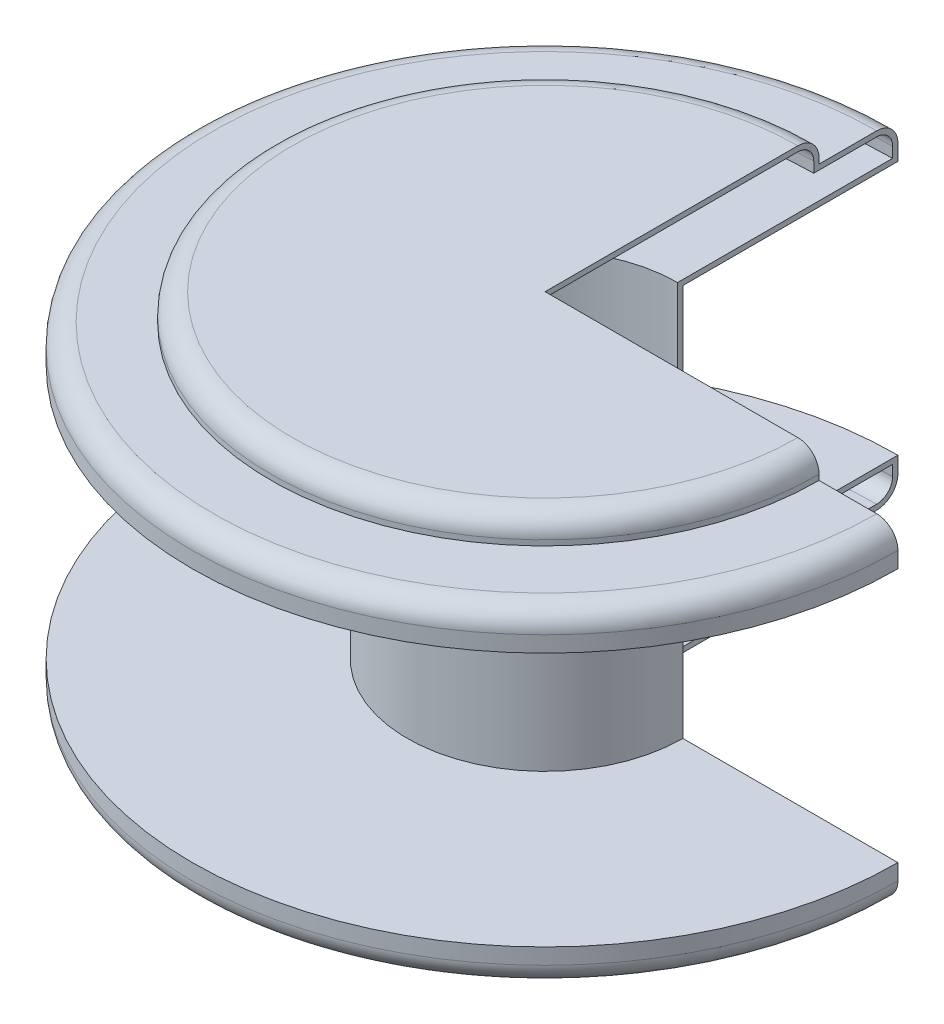
ISO-10303-21;
HEADER;
FILE_DESCRIPTION(('STEP AP214'),'2;1');
FILE_NAME('part.step','',(''),(''),'','','');
FILE_SCHEMA(('AUTOMOTIVE_DESIGN { 1 0 10303 214 1 1 1 1 }'));
ENDSEC;
DATA;
#1=APPLICATION_CONTEXT('core data for automotive mechanical design processes');
#2=APPLICATION_PROTOCOL_DEFINITION('international standard','automotive_design',2000,#1);
#3=PRODUCT_CONTEXT('',#1,'mechanical');
#4=PRODUCT('Part','Part','',(#3));
#5=PRODUCT_RELATED_PRODUCT_CATEGORY('part','',(#4));
#6=PRODUCT_DEFINITION_FORMATION('','',#4);
#7=PRODUCT_DEFINITION_CONTEXT('part definition',#1,'design');
#8=PRODUCT_DEFINITION('design','',#6,#7);
#9=PRODUCT_DEFINITION_SHAPE('','',#8);
#10=(LENGTH_UNIT() NAMED_UNIT(*) SI_UNIT(.MILLI.,.METRE.));
#11=(NAMED_UNIT(*) PLANE_ANGLE_UNIT() SI_UNIT($,.RADIAN.));
#12=(NAMED_UNIT(*) SI_UNIT($,.STERADIAN.) SOLID_ANGLE_UNIT());
#13=UNCERTAINTY_MEASURE_WITH_UNIT(LENGTH_MEASURE(1.E-05),#10,'distance_accuracy_value','');
#14=(GEOMETRIC_REPRESENTATION_CONTEXT(3) GLOBAL_UNCERTAINTY_ASSIGNED_CONTEXT((#13)) GLOBAL_UNIT_ASSIGNED_CONTEXT((#10,
#11,#12)) REPRESENTATION_CONTEXT('',''));
#15=CARTESIAN_POINT('',(0.,0.,0.));
#16=DIRECTION('',(0.,0.,1.));
#17=DIRECTION('',(1.,0.,0.));
#18=AXIS2_PLACEMENT_3D('',#15,#16,#17);
#19=CARTESIAN_POINT('',(-24.9999999999995,36.,-47.6919728870048));
#20=DIRECTION('',(0.,-1.,0.));
#21=DIRECTION('',(0.,0.,-1.));
#22=AXIS2_PLACEMENT_3D('',#19,#20,#21);
#23=PLANE('',#22);
#24=DIRECTION('',(1.,0.,0.));
#25=VECTOR('',#24,1.);
#26=CARTESIAN_POINT('',(22.6919728870048,36.,0.));
#27=LINE('',#26,#25);
#28=CARTESIAN_POINT('',(22.6919728870048,36.,0.));
#29=VERTEX_POINT('',#28);
#30=CARTESIAN_POINT('',(-25.,36.,0.));
#31=VERTEX_POINT('',#30);
#32=EDGE_CURVE('E257',#29,#31,#27,.F.);
#33=ORIENTED_EDGE('',*,*,#32,.T.);
#34=DIRECTION('',(0.,0.,-1.));
#35=VECTOR('',#34,1.);
#36=CARTESIAN_POINT('',(-24.9999999999995,36.,-47.6919728870048));
#37=LINE('',#36,#35);
#38=CARTESIAN_POINT('',(-24.9999999999995,36.,-47.6919728870048));
#39=VERTEX_POINT('',#38);
#40=EDGE_CURVE('E371',#39,#31,#37,.F.);
#41=ORIENTED_EDGE('',*,*,#40,.F.);
#42=CARTESIAN_POINT('',(-25.,36.,0.));
#43=DIRECTION('',(0.,1.,0.));
#44=DIRECTION('',(0.,0.,1.));
#45=AXIS2_PLACEMENT_3D('',#42,#43,#44);
#46=CIRCLE('',#45,47.6919728870048);
#47=EDGE_CURVE('E59',#39,#29,#46,.T.);
#48=ORIENTED_EDGE('',*,*,#47,.T.);
#49=EDGE_LOOP('',(#33,#41,#48));
#50=FACE_BOUND('',#49,.T.);
#51=ADVANCED_FACE('F43',(#50),#23,.F.);
#52=CARTESIAN_POINT('',(-24.9999999999995,35.,-47.6919728870048));
#53=DIRECTION('',(0.,-1.,0.));
#54=DIRECTION('',(0.,0.,-1.));
#55=AXIS2_PLACEMENT_3D('',#52,#53,#54);
#56=PLANE('',#55);
#57=CARTESIAN_POINT('',(-25.,35.,0.));
#58=DIRECTION('',(0.,1.,0.));
#59=DIRECTION('',(0.,0.,1.));
#60=AXIS2_PLACEMENT_3D('',#57,#58,#59);
#61=CIRCLE('',#60,47.6919728870048);
#62=CARTESIAN_POINT('',(-24.9999999999995,35.,-47.6919728870048));
#63=VERTEX_POINT('',#62);
#64=CARTESIAN_POINT('',(22.6919728870048,35.,0.));
#65=VERTEX_POINT('',#64);
#66=EDGE_CURVE('E11',#63,#65,#61,.T.);
#67=ORIENTED_EDGE('',*,*,#66,.F.);
#68=DIRECTION('',(0.,0.,1.));
#69=VECTOR('',#68,1.);
#70=CARTESIAN_POINT('',(-24.9999999999995,35.,-47.6919728870048));
#71=LINE('',#70,#69);
#72=CARTESIAN_POINT('',(-25.,35.,0.));
#73=VERTEX_POINT('',#72);
#74=EDGE_CURVE('E253',#63,#73,#71,.T.);
#75=ORIENTED_EDGE('',*,*,#74,.T.);
#76=DIRECTION('',(-1.,0.,0.));
#77=VECTOR('',#76,1.);
#78=CARTESIAN_POINT('',(22.6919728870048,35.,0.));
#79=LINE('',#78,#77);
#80=EDGE_CURVE('E252',#65,#73,#79,.T.);
#81=ORIENTED_EDGE('',*,*,#80,.F.);
#82=EDGE_LOOP('',(#67,#75,#81));
#83=FACE_BOUND('',#82,.T.);
#84=ADVANCED_FACE('F45',(#83),#56,.T.);
#85=CARTESIAN_POINT('',(-25.,32.,0.));
#86=DIRECTION('',(0.,1.,0.));
#87=DIRECTION('',(0.,0.,1.));
#88=AXIS2_PLACEMENT_3D('',#85,#86,#87);
#89=TOROIDAL_SURFACE('',#88,47.6919728870048,3.);
#90=CARTESIAN_POINT('',(-25.,32.,0.));
#91=DIRECTION('',(0.,1.,0.));
#92=DIRECTION('',(0.,0.,1.));
#93=AXIS2_PLACEMENT_3D('',#90,#91,#92);
#94=CIRCLE('',#93,50.6919728870048);
#95=CARTESIAN_POINT('',(-24.9999999999995,32.,-50.6919728870048));
#96=VERTEX_POINT('',#95);
#97=CARTESIAN_POINT('',(25.6919728870048,32.,0.));
#98=VERTEX_POINT('',#97);
#99=EDGE_CURVE('E52',#96,#98,#94,.T.);
#100=ORIENTED_EDGE('',*,*,#99,.F.);
#101=CARTESIAN_POINT('',(-24.9999999999995,32.,-47.6919728870048));
#102=DIRECTION('',(1.,0.,0.));
#103=DIRECTION('',(0.,0.,1.));
#104=AXIS2_PLACEMENT_3D('',#101,#102,#103);
#105=CIRCLE('',#104,3.);
#106=EDGE_CURVE('E248',#96,#63,#105,.T.);
#107=ORIENTED_EDGE('',*,*,#106,.T.);
#108=ORIENTED_EDGE('',*,*,#66,.T.);
#109=CARTESIAN_POINT('',(22.6919728870048,32.,0.));
#110=DIRECTION('',(0.,0.,1.));
#111=DIRECTION('',(-1.,0.,0.));
#112=AXIS2_PLACEMENT_3D('',#109,#110,#111);
#113=CIRCLE('',#112,3.);
#114=EDGE_CURVE('E245',#98,#65,#113,.T.);
#115=ORIENTED_EDGE('',*,*,#114,.F.);
#116=EDGE_LOOP('',(#100,#107,#108,#115));
#117=FACE_BOUND('',#116,.T.);
#118=ADVANCED_FACE('F243',(#117),#89,.F.);
#119=CARTESIAN_POINT('',(-25.,35.,0.));
#120=DIRECTION('',(0.,1.,0.));
#121=DIRECTION('',(0.,0.,1.));
#122=AXIS2_PLACEMENT_3D('',#119,#120,#121);
#123=CYLINDRICAL_SURFACE('',#122,50.6919728870048);
#124=CARTESIAN_POINT('',(-25.,30.,0.));
#125=DIRECTION('',(0.,1.,0.));
#126=DIRECTION('',(0.,0.,1.));
#127=AXIS2_PLACEMENT_3D('',#124,#125,#126);
#128=CIRCLE('',#127,50.6919728870048);
#129=CARTESIAN_POINT('',(-24.9999999999995,30.,-50.6919728870048));
#130=VERTEX_POINT('',#129);
#131=CARTESIAN_POINT('',(25.6919728870048,30.,0.));
#132=VERTEX_POINT('',#131);
#133=EDGE_CURVE('E565',#130,#132,#128,.T.);
#134=ORIENTED_EDGE('',*,*,#133,.F.);
#135=DIRECTION('',(0.,1.,0.));
#136=VECTOR('',#135,1.);
#137=CARTESIAN_POINT('',(-24.9999999999995,30.,-50.6919728870048));
#138=LINE('',#137,#136);
#139=EDGE_CURVE('E382',#130,#96,#138,.T.);
#140=ORIENTED_EDGE('',*,*,#139,.T.);
#141=ORIENTED_EDGE('',*,*,#99,.T.);
#142=DIRECTION('',(0.,1.,0.));
#143=VECTOR('',#142,1.);
#144=CARTESIAN_POINT('',(25.6919728870048,30.,0.));
#145=LINE('',#144,#143);
#146=EDGE_CURVE('E263',#132,#98,#145,.T.);
#147=ORIENTED_EDGE('',*,*,#146,.F.);
#148=EDGE_LOOP('',(#134,#140,#141,#147));
#149=FACE_BOUND('',#148,.T.);
#150=ADVANCED_FACE('F569',(#149),#123,.F.);
#151=CARTESIAN_POINT('',(-24.9999999999993,30.,-62.5662729794813));
#152=DIRECTION('',(0.,-1.,0.));
#153=DIRECTION('',(0.,0.,-1.));
#154=AXIS2_PLACEMENT_3D('',#151,#152,#153);
#155=PLANE('',#154);
#156=CARTESIAN_POINT('',(-25.,30.,0.));
#157=DIRECTION('',(0.,1.,0.));
#158=DIRECTION('',(0.,0.,1.));
#159=AXIS2_PLACEMENT_3D('',#156,#157,#158);
#160=CIRCLE('',#159,62.5662729794813);
#161=CARTESIAN_POINT('',(-24.9999999999993,30.,-62.5662729794813));
#162=VERTEX_POINT('',#161);
#163=CARTESIAN_POINT('',(37.5662729794813,30.,0.));
#164=VERTEX_POINT('',#163);
#165=EDGE_CURVE('E562',#162,#164,#160,.T.);
#166=ORIENTED_EDGE('',*,*,#165,.F.);
#167=DIRECTION('',(0.,0.,1.));
#168=VECTOR('',#167,1.);
#169=CARTESIAN_POINT('',(-24.9999999999993,30.,-62.5662729794813));
#170=LINE('',#169,#168);
#171=EDGE_CURVE('E386',#162,#130,#170,.T.);
#172=ORIENTED_EDGE('',*,*,#171,.T.);
#173=ORIENTED_EDGE('',*,*,#133,.T.);
#174=DIRECTION('',(-1.,0.,0.));
#175=VECTOR('',#174,1.);
#176=CARTESIAN_POINT('',(37.5662729794813,30.,0.));
#177=LINE('',#176,#175);
#178=EDGE_CURVE('E267',#164,#132,#177,.T.);
#179=ORIENTED_EDGE('',*,*,#178,.F.);
#180=EDGE_LOOP('',(#166,#172,#173,#179));
#181=FACE_BOUND('',#180,.T.);
#182=ADVANCED_FACE('F675',(#181),#155,.T.);
#183=CARTESIAN_POINT('',(-25.,27.,0.));
#184=DIRECTION('',(0.,1.,0.));
#185=DIRECTION('',(0.,0.,1.));
#186=AXIS2_PLACEMENT_3D('',#183,#184,#185);
#187=TOROIDAL_SURFACE('',#186,62.5662729794813,3.);
#188=CARTESIAN_POINT('',(-25.,27.,0.));
#189=DIRECTION('',(0.,1.,0.));
#190=DIRECTION('',(0.,0.,1.));
#191=AXIS2_PLACEMENT_3D('',#188,#189,#190);
#192=CIRCLE('',#191,65.5662729794812);
#193=CARTESIAN_POINT('',(-24.9999999999993,27.,-65.5662729794812));
#194=VERTEX_POINT('',#193);
#195=CARTESIAN_POINT('',(40.5662729794813,27.,0.));
#196=VERTEX_POINT('',#195);
#197=EDGE_CURVE('E559',#194,#196,#192,.T.);
#198=ORIENTED_EDGE('',*,*,#197,.F.);
#199=CARTESIAN_POINT('',(-24.9999999999993,27.,-62.5662729794813));
#200=DIRECTION('',(1.,0.,0.));
#201=DIRECTION('',(0.,0.,1.));
#202=AXIS2_PLACEMENT_3D('',#199,#200,#201);
#203=CIRCLE('',#202,3.);
#204=EDGE_CURVE('E390',#194,#162,#203,.T.);
#205=ORIENTED_EDGE('',*,*,#204,.T.);
#206=ORIENTED_EDGE('',*,*,#165,.T.);
#207=CARTESIAN_POINT('',(37.5662729794813,27.,0.));
#208=DIRECTION('',(0.,0.,1.));
#209=DIRECTION('',(-1.,0.,0.));
#210=AXIS2_PLACEMENT_3D('',#207,#208,#209);
#211=CIRCLE('',#210,3.);
#212=EDGE_CURVE('E273',#196,#164,#211,.T.);
#213=ORIENTED_EDGE('',*,*,#212,.F.);
#214=EDGE_LOOP('',(#198,#205,#206,#213));
#215=FACE_BOUND('',#214,.T.);
#216=ADVANCED_FACE('F672',(#215),#187,.F.);
#217=CARTESIAN_POINT('',(-25.,35.,0.));
#218=DIRECTION('',(0.,1.,0.));
#219=DIRECTION('',(0.,0.,1.));
#220=AXIS2_PLACEMENT_3D('',#217,#218,#219);
#221=CYLINDRICAL_SURFACE('',#220,65.5662729794812);
#222=CARTESIAN_POINT('',(-25.,25.,0.));
#223=DIRECTION('',(0.,1.,0.));
#224=DIRECTION('',(0.,0.,1.));
#225=AXIS2_PLACEMENT_3D('',#222,#223,#224);
#226=CIRCLE('',#225,65.5662729794811);
#227=CARTESIAN_POINT('',(-24.9999999999993,25.,-65.5662729794811));
#228=VERTEX_POINT('',#227);
#229=CARTESIAN_POINT('',(40.5662729794811,25.,0.));
#230=VERTEX_POINT('',#229);
#231=EDGE_CURVE('E556',#228,#230,#226,.T.);
#232=ORIENTED_EDGE('',*,*,#231,.F.);
#233=DIRECTION('',(0.,1.,0.));
#234=VECTOR('',#233,1.);
#235=CARTESIAN_POINT('',(-24.9999999999993,25.,-65.5662729794811));
#236=LINE('',#235,#234);
#237=EDGE_CURVE('E394',#228,#194,#236,.T.);
#238=ORIENTED_EDGE('',*,*,#237,.T.);
#239=ORIENTED_EDGE('',*,*,#197,.T.);
#240=DIRECTION('',(0.,1.,0.));
#241=VECTOR('',#240,1.);
#242=CARTESIAN_POINT('',(40.5662729794811,25.,0.));
#243=LINE('',#242,#241);
#244=EDGE_CURVE('E277',#230,#196,#243,.T.);
#245=ORIENTED_EDGE('',*,*,#244,.F.);
#246=EDGE_LOOP('',(#232,#238,#239,#245));
#247=FACE_BOUND('',#246,.T.);
#248=ADVANCED_FACE('F668',(#247),#221,.F.);
#249=CARTESIAN_POINT('',(-24.9999999999997,25.,-24.9999999999999));
#250=DIRECTION('',(0.,1.,0.));
#251=DIRECTION('',(0.,0.,1.));
#252=AXIS2_PLACEMENT_3D('',#249,#250,#251);
#253=PLANE('',#252);
#254=CARTESIAN_POINT('',(-25.,25.,0.));
#255=DIRECTION('',(0.,1.,0.));
#256=DIRECTION('',(0.,0.,1.));
#257=AXIS2_PLACEMENT_3D('',#254,#255,#256);
#258=CIRCLE('',#257,24.9999999999999);
#259=CARTESIAN_POINT('',(-24.9999999999997,25.,-24.9999999999999));
#260=VERTEX_POINT('',#259);
#261=CARTESIAN_POINT('',(0.,25.,0.));
#262=VERTEX_POINT('',#261);
#263=EDGE_CURVE('E553',#260,#262,#258,.T.);
#264=ORIENTED_EDGE('',*,*,#263,.F.);
#265=DIRECTION('',(0.,0.,-1.));
#266=VECTOR('',#265,1.);
#267=CARTESIAN_POINT('',(-24.9999999999997,25.,-24.9999999999999));
#268=LINE('',#267,#266);
#269=EDGE_CURVE('E398',#260,#228,#268,.T.);
#270=ORIENTED_EDGE('',*,*,#269,.T.);
#271=ORIENTED_EDGE('',*,*,#231,.T.);
#272=DIRECTION('',(1.,0.,0.));
#273=VECTOR('',#272,1.);
#274=CARTESIAN_POINT('',(0.,25.,0.));
#275=LINE('',#274,#273);
#276=EDGE_CURVE('E281',#262,#230,#275,.T.);
#277=ORIENTED_EDGE('',*,*,#276,.F.);
#278=EDGE_LOOP('',(#264,#270,#271,#277));
#279=FACE_BOUND('',#278,.T.);
#280=ADVANCED_FACE('F664',(#279),#253,.T.);
#281=CARTESIAN_POINT('',(-25.,35.,0.));
#282=DIRECTION('',(0.,1.,0.));
#283=DIRECTION('',(0.,0.,1.));
#284=AXIS2_PLACEMENT_3D('',#281,#282,#283);
#285=CYLINDRICAL_SURFACE('',#284,25.);
#286=CARTESIAN_POINT('',(-25.,-25.,0.));
#287=DIRECTION('',(0.,1.,0.));
#288=DIRECTION('',(0.,0.,1.));
#289=AXIS2_PLACEMENT_3D('',#286,#287,#288);
#290=CIRCLE('',#289,25.);
#291=CARTESIAN_POINT('',(-24.9999999999997,-25.,-25.));
#292=VERTEX_POINT('',#291);
#293=CARTESIAN_POINT('',(0.,-25.,0.));
#294=VERTEX_POINT('',#293);
#295=EDGE_CURVE('E550',#292,#294,#290,.T.);
#296=ORIENTED_EDGE('',*,*,#295,.F.);
#297=DIRECTION('',(0.,1.,0.));
#298=VECTOR('',#297,1.);
#299=CARTESIAN_POINT('',(-24.9999999999997,25.,-24.9999999999999));
#300=LINE('',#299,#298);
#301=EDGE_CURVE('E402',#292,#260,#300,.T.);
#302=ORIENTED_EDGE('',*,*,#301,.T.);
#303=ORIENTED_EDGE('',*,*,#263,.T.);
#304=DIRECTION('',(0.,1.,0.));
#305=VECTOR('',#304,1.);
#306=CARTESIAN_POINT('',(0.,25.,0.));
#307=LINE('',#306,#305);
#308=EDGE_CURVE('E285',#294,#262,#307,.T.);
#309=ORIENTED_EDGE('',*,*,#308,.F.);
#310=EDGE_LOOP('',(#296,#302,#303,#309));
#311=FACE_BOUND('',#310,.T.);
#312=ADVANCED_FACE('F660',(#311),#285,.F.);
#313=CARTESIAN_POINT('',(-24.9999999999997,-25.,-25.));
#314=DIRECTION('',(0.,-1.,0.));
#315=DIRECTION('',(0.,0.,-1.));
#316=AXIS2_PLACEMENT_3D('',#313,#314,#315);
#317=PLANE('',#316);
#318=CARTESIAN_POINT('',(-25.,-25.,0.));
#319=DIRECTION('',(0.,1.,0.));
#320=DIRECTION('',(0.,0.,1.));
#321=AXIS2_PLACEMENT_3D('',#318,#319,#320);
#322=CIRCLE('',#321,65.5662729794813);
#323=CARTESIAN_POINT('',(-24.9999999999993,-25.,-65.5662729794813));
#324=VERTEX_POINT('',#323);
#325=CARTESIAN_POINT('',(40.5662729794813,-25.,0.));
#326=VERTEX_POINT('',#325);
#327=EDGE_CURVE('E547',#324,#326,#322,.T.);
#328=ORIENTED_EDGE('',*,*,#327,.F.);
#329=DIRECTION('',(0.,0.,1.));
#330=VECTOR('',#329,1.);
#331=CARTESIAN_POINT('',(-24.9999999999997,-25.,-25.));
#332=LINE('',#331,#330);
#333=EDGE_CURVE('E406',#324,#292,#332,.T.);
#334=ORIENTED_EDGE('',*,*,#333,.T.);
#335=ORIENTED_EDGE('',*,*,#295,.T.);
#336=DIRECTION('',(-1.,0.,0.));
#337=VECTOR('',#336,1.);
#338=CARTESIAN_POINT('',(0.,-25.,0.));
#339=LINE('',#338,#337);
#340=EDGE_CURVE('E289',#326,#294,#339,.T.);
#341=ORIENTED_EDGE('',*,*,#340,.F.);
#342=EDGE_LOOP('',(#328,#334,#335,#341));
#343=FACE_BOUND('',#342,.T.);
#344=ADVANCED_FACE('F656',(#343),#317,.T.);
#345=CARTESIAN_POINT('',(-25.,35.,0.));
#346=DIRECTION('',(0.,1.,0.));
#347=DIRECTION('',(0.,0.,1.));
#348=AXIS2_PLACEMENT_3D('',#345,#346,#347);
#349=CYLINDRICAL_SURFACE('',#348,65.5662729794813);
#350=CARTESIAN_POINT('',(-25.,-27.,0.));
#351=DIRECTION('',(0.,1.,0.));
#352=DIRECTION('',(0.,0.,1.));
#353=AXIS2_PLACEMENT_3D('',#350,#351,#352);
#354=CIRCLE('',#353,65.5662729794812);
#355=CARTESIAN_POINT('',(-24.9999999999993,-27.,-65.5662729794812));
#356=VERTEX_POINT('',#355);
#357=CARTESIAN_POINT('',(40.5662729794813,-27.,0.));
#358=VERTEX_POINT('',#357);
#359=EDGE_CURVE('E544',#356,#358,#354,.T.);
#360=ORIENTED_EDGE('',*,*,#359,.F.);
#361=DIRECTION('',(0.,1.,0.));
#362=VECTOR('',#361,1.);
#363=CARTESIAN_POINT('',(-24.9999999999993,-25.,-65.5662729794813));
#364=LINE('',#363,#362);
#365=EDGE_CURVE('E410',#356,#324,#364,.T.);
#366=ORIENTED_EDGE('',*,*,#365,.T.);
#367=ORIENTED_EDGE('',*,*,#327,.T.);
#368=DIRECTION('',(0.,1.,0.));
#369=VECTOR('',#368,1.);
#370=CARTESIAN_POINT('',(40.5662729794813,-25.,0.));
#371=LINE('',#370,#369);
#372=EDGE_CURVE('E293',#358,#326,#371,.T.);
#373=ORIENTED_EDGE('',*,*,#372,.F.);
#374=EDGE_LOOP('',(#360,#366,#367,#373));
#375=FACE_BOUND('',#374,.T.);
#376=ADVANCED_FACE('F652',(#375),#349,.F.);
#377=CARTESIAN_POINT('',(-25.,-27.,0.));
#378=DIRECTION('',(0.,1.,0.));
#379=DIRECTION('',(0.,0.,1.));
#380=AXIS2_PLACEMENT_3D('',#377,#378,#379);
#381=TOROIDAL_SURFACE('',#380,62.5662729794813,3.);
#382=CARTESIAN_POINT('',(-25.,-30.,0.));
#383=DIRECTION('',(0.,1.,0.));
#384=DIRECTION('',(0.,0.,1.));
#385=AXIS2_PLACEMENT_3D('',#382,#383,#384);
#386=CIRCLE('',#385,62.5662729794813);
#387=CARTESIAN_POINT('',(-24.9999999999993,-30.,-62.5662729794813));
#388=VERTEX_POINT('',#387);
#389=CARTESIAN_POINT('',(37.5662729794813,-30.,0.));
#390=VERTEX_POINT('',#389);
#391=EDGE_CURVE('E541',#388,#390,#386,.T.);
#392=ORIENTED_EDGE('',*,*,#391,.F.);
#393=CARTESIAN_POINT('',(-24.9999999999993,-27.,-62.5662729794813));
#394=DIRECTION('',(1.,0.,0.));
#395=DIRECTION('',(0.,0.,-1.));
#396=AXIS2_PLACEMENT_3D('',#393,#394,#395);
#397=CIRCLE('',#396,3.);
#398=EDGE_CURVE('E414',#388,#356,#397,.T.);
#399=ORIENTED_EDGE('',*,*,#398,.T.);
#400=ORIENTED_EDGE('',*,*,#359,.T.);
#401=CARTESIAN_POINT('',(37.5662729794813,-27.,0.));
#402=DIRECTION('',(0.,0.,1.));
#403=DIRECTION('',(1.,0.,0.));
#404=AXIS2_PLACEMENT_3D('',#401,#402,#403);
#405=CIRCLE('',#404,3.);
#406=EDGE_CURVE('E297',#390,#358,#405,.T.);
#407=ORIENTED_EDGE('',*,*,#406,.F.);
#408=EDGE_LOOP('',(#392,#399,#400,#407));
#409=FACE_BOUND('',#408,.T.);
#410=ADVANCED_FACE('F648',(#409),#381,.F.);
#411=CARTESIAN_POINT('',(-24.9999999999993,-30.,-62.5662729794813));
#412=DIRECTION('',(0.,1.,0.));
#413=DIRECTION('',(0.,0.,1.));
#414=AXIS2_PLACEMENT_3D('',#411,#412,#413);
#415=PLANE('',#414);
#416=CARTESIAN_POINT('',(-25.,-30.,0.));
#417=DIRECTION('',(0.,1.,0.));
#418=DIRECTION('',(0.,0.,1.));
#419=AXIS2_PLACEMENT_3D('',#416,#417,#418);
#420=CIRCLE('',#419,50.6919728870048);
#421=CARTESIAN_POINT('',(-24.9999999999995,-30.,-50.6919728870048));
#422=VERTEX_POINT('',#421);
#423=CARTESIAN_POINT('',(25.6919728870048,-30.,0.));
#424=VERTEX_POINT('',#423);
#425=EDGE_CURVE('E538',#422,#424,#420,.T.);
#426=ORIENTED_EDGE('',*,*,#425,.F.);
#427=DIRECTION('',(0.,0.,-1.));
#428=VECTOR('',#427,1.);
#429=CARTESIAN_POINT('',(-24.9999999999993,-30.,-62.5662729794813));
#430=LINE('',#429,#428);
#431=EDGE_CURVE('E418',#422,#388,#430,.T.);
#432=ORIENTED_EDGE('',*,*,#431,.T.);
#433=ORIENTED_EDGE('',*,*,#391,.T.);
#434=DIRECTION('',(1.,0.,0.));
#435=VECTOR('',#434,1.);
#436=CARTESIAN_POINT('',(37.5662729794813,-30.,0.));
#437=LINE('',#436,#435);
#438=EDGE_CURVE('E301',#424,#390,#437,.T.);
#439=ORIENTED_EDGE('',*,*,#438,.F.);
#440=EDGE_LOOP('',(#426,#432,#433,#439));
#441=FACE_BOUND('',#440,.T.);
#442=ADVANCED_FACE('F644',(#441),#415,.T.);
#443=CARTESIAN_POINT('',(-25.,35.,0.));
#444=DIRECTION('',(0.,1.,0.));
#445=DIRECTION('',(0.,0.,1.));
#446=AXIS2_PLACEMENT_3D('',#443,#444,#445);
#447=CYLINDRICAL_SURFACE('',#446,50.6919728870048);
#448=CARTESIAN_POINT('',(-25.,-32.,0.));
#449=DIRECTION('',(0.,1.,0.));
#450=DIRECTION('',(0.,0.,1.));
#451=AXIS2_PLACEMENT_3D('',#448,#449,#450);
#452=CIRCLE('',#451,50.6919728870048);
#453=CARTESIAN_POINT('',(-24.9999999999995,-32.,-50.6919728870048));
#454=VERTEX_POINT('',#453);
#455=CARTESIAN_POINT('',(25.6919728870048,-32.,0.));
#456=VERTEX_POINT('',#455);
#457=EDGE_CURVE('E535',#454,#456,#452,.T.);
#458=ORIENTED_EDGE('',*,*,#457,.F.);
#459=DIRECTION('',(0.,1.,0.));
#460=VECTOR('',#459,1.);
#461=CARTESIAN_POINT('',(-24.9999999999995,-30.,-50.6919728870048));
#462=LINE('',#461,#460);
#463=EDGE_CURVE('E422',#454,#422,#462,.T.);
#464=ORIENTED_EDGE('',*,*,#463,.T.);
#465=ORIENTED_EDGE('',*,*,#425,.T.);
#466=DIRECTION('',(0.,1.,0.));
#467=VECTOR('',#466,1.);
#468=CARTESIAN_POINT('',(25.6919728870048,-30.,0.));
#469=LINE('',#468,#467);
#470=EDGE_CURVE('E305',#456,#424,#469,.T.);
#471=ORIENTED_EDGE('',*,*,#470,.F.);
#472=EDGE_LOOP('',(#458,#464,#465,#471));
#473=FACE_BOUND('',#472,.T.);
#474=ADVANCED_FACE('F640',(#473),#447,.F.);
#475=CARTESIAN_POINT('',(-25.,-32.,0.));
#476=DIRECTION('',(0.,1.,0.));
#477=DIRECTION('',(0.,0.,1.));
#478=AXIS2_PLACEMENT_3D('',#475,#476,#477);
#479=TOROIDAL_SURFACE('',#478,47.6919728870048,3.);
#480=CARTESIAN_POINT('',(-25.,-35.,0.));
#481=DIRECTION('',(0.,1.,0.));
#482=DIRECTION('',(0.,0.,1.));
#483=AXIS2_PLACEMENT_3D('',#480,#481,#482);
#484=CIRCLE('',#483,47.6919728870048);
#485=CARTESIAN_POINT('',(-24.9999999999995,-35.,-47.6919728870048));
#486=VERTEX_POINT('',#485);
#487=CARTESIAN_POINT('',(22.6919728870048,-35.,0.));
#488=VERTEX_POINT('',#487);
#489=EDGE_CURVE('E532',#486,#488,#484,.T.);
#490=ORIENTED_EDGE('',*,*,#489,.F.);
#491=CARTESIAN_POINT('',(-24.9999999999995,-32.,-47.6919728870048));
#492=DIRECTION('',(1.,0.,0.));
#493=DIRECTION('',(0.,0.,-1.));
#494=AXIS2_PLACEMENT_3D('',#491,#492,#493);
#495=CIRCLE('',#494,3.);
#496=EDGE_CURVE('E426',#486,#454,#495,.T.);
#497=ORIENTED_EDGE('',*,*,#496,.T.);
#498=ORIENTED_EDGE('',*,*,#457,.T.);
#499=CARTESIAN_POINT('',(22.6919728870048,-32.,0.));
#500=DIRECTION('',(0.,0.,1.));
#501=DIRECTION('',(1.,0.,0.));
#502=AXIS2_PLACEMENT_3D('',#499,#500,#501);
#503=CIRCLE('',#502,3.);
#504=EDGE_CURVE('E309',#488,#456,#503,.T.);
#505=ORIENTED_EDGE('',*,*,#504,.F.);
#506=EDGE_LOOP('',(#490,#497,#498,#505));
#507=FACE_BOUND('',#506,.T.);
#508=ADVANCED_FACE('F638',(#507),#479,.F.);
#509=CARTESIAN_POINT('',(-24.9999999999995,-35.,-47.6919728870048));
#510=DIRECTION('',(0.,1.,0.));
#511=DIRECTION('',(0.,0.,1.));
#512=AXIS2_PLACEMENT_3D('',#509,#510,#511);
#513=PLANE('',#512);
#514=DIRECTION('',(1.,0.,0.));
#515=VECTOR('',#514,1.);
#516=CARTESIAN_POINT('',(22.6919728870048,-35.,0.));
#517=LINE('',#516,#515);
#518=CARTESIAN_POINT('',(-25.,-35.,0.));
#519=VERTEX_POINT('',#518);
#520=EDGE_CURVE('E313',#519,#488,#517,.T.);
#521=ORIENTED_EDGE('',*,*,#520,.F.);
#522=DIRECTION('',(0.,0.,-1.));
#523=VECTOR('',#522,1.);
#524=CARTESIAN_POINT('',(-24.9999999999995,-35.,-47.6919728870048));
#525=LINE('',#524,#523);
#526=EDGE_CURVE('E430',#519,#486,#525,.T.);
#527=ORIENTED_EDGE('',*,*,#526,.T.);
#528=ORIENTED_EDGE('',*,*,#489,.T.);
#529=EDGE_LOOP('',(#521,#527,#528));
#530=FACE_BOUND('',#529,.T.);
#531=ADVANCED_FACE('F634',(#530),#513,.T.);
#532=CARTESIAN_POINT('',(-24.9999999999995,-36.,-47.6919728870048));
#533=DIRECTION('',(0.,1.,0.));
#534=DIRECTION('',(0.,0.,1.));
#535=AXIS2_PLACEMENT_3D('',#532,#533,#534);
#536=PLANE('',#535);
#537=CARTESIAN_POINT('',(-25.,-36.,0.));
#538=DIRECTION('',(0.,1.,0.));
#539=DIRECTION('',(0.,0.,1.));
#540=AXIS2_PLACEMENT_3D('',#537,#538,#539);
#541=CIRCLE('',#540,47.6919728870048);
#542=CARTESIAN_POINT('',(-24.9999999999995,-36.,-47.6919728870048));
#543=VERTEX_POINT('',#542);
#544=CARTESIAN_POINT('',(22.6919728870048,-36.,0.));
#545=VERTEX_POINT('',#544);
#546=EDGE_CURVE('E529',#543,#545,#541,.T.);
#547=ORIENTED_EDGE('',*,*,#546,.F.);
#548=DIRECTION('',(0.,0.,-1.));
#549=VECTOR('',#548,1.);
#550=CARTESIAN_POINT('',(-24.9999999999995,-36.,-47.6919728870048));
#551=LINE('',#550,#549);
#552=CARTESIAN_POINT('',(-25.,-36.,0.));
#553=VERTEX_POINT('',#552);
#554=EDGE_CURVE('E437',#553,#543,#551,.T.);
#555=ORIENTED_EDGE('',*,*,#554,.F.);
#556=DIRECTION('',(1.,0.,0.));
#557=VECTOR('',#556,1.);
#558=CARTESIAN_POINT('',(22.6919728870048,-36.,0.));
#559=LINE('',#558,#557);
#560=EDGE_CURVE('E317',#553,#545,#559,.T.);
#561=ORIENTED_EDGE('',*,*,#560,.T.);
#562=EDGE_LOOP('',(#547,#555,#561));
#563=FACE_BOUND('',#562,.T.);
#564=ADVANCED_FACE('F627',(#563),#536,.F.);
#565=CARTESIAN_POINT('',(-25.,-32.,0.));
#566=DIRECTION('',(0.,1.,0.));
#567=DIRECTION('',(0.,0.,1.));
#568=AXIS2_PLACEMENT_3D('',#565,#566,#567);
#569=TOROIDAL_SURFACE('',#568,47.6919728870048,4.);
#570=CARTESIAN_POINT('',(-25.,-32.,0.));
#571=DIRECTION('',(0.,1.,0.));
#572=DIRECTION('',(0.,0.,1.));
#573=AXIS2_PLACEMENT_3D('',#570,#571,#572);
#574=CIRCLE('',#573,51.6919728870048);
#575=CARTESIAN_POINT('',(-24.9999999999994,-32.,-51.6919728870048));
#576=VERTEX_POINT('',#575);
#577=CARTESIAN_POINT('',(26.6919728870048,-32.,0.));
#578=VERTEX_POINT('',#577);
#579=EDGE_CURVE('E526',#576,#578,#574,.T.);
#580=ORIENTED_EDGE('',*,*,#579,.F.);
#581=CARTESIAN_POINT('',(-24.9999999999995,-32.,-47.6919728870048));
#582=DIRECTION('',(1.,0.,0.));
#583=DIRECTION('',(0.,0.,-1.));
#584=AXIS2_PLACEMENT_3D('',#581,#582,#583);
#585=CIRCLE('',#584,4.);
#586=EDGE_CURVE('E441',#543,#576,#585,.T.);
#587=ORIENTED_EDGE('',*,*,#586,.F.);
#588=ORIENTED_EDGE('',*,*,#546,.T.);
#589=CARTESIAN_POINT('',(22.6919728870048,-32.,0.));
#590=DIRECTION('',(0.,0.,1.));
#591=DIRECTION('',(1.,0.,0.));
#592=AXIS2_PLACEMENT_3D('',#589,#590,#591);
#593=CIRCLE('',#592,4.);
#594=EDGE_CURVE('E321',#545,#578,#593,.T.);
#595=ORIENTED_EDGE('',*,*,#594,.T.);
#596=EDGE_LOOP('',(#580,#587,#588,#595));
#597=FACE_BOUND('',#596,.T.);
#598=ADVANCED_FACE('F624',(#597),#569,.T.);
#599=CARTESIAN_POINT('',(-25.,35.,0.));
#600=DIRECTION('',(0.,1.,0.));
#601=DIRECTION('',(0.,0.,1.));
#602=AXIS2_PLACEMENT_3D('',#599,#600,#601);
#603=CYLINDRICAL_SURFACE('',#602,51.6919728870048);
#604=CARTESIAN_POINT('',(-25.,-31.,0.));
#605=DIRECTION('',(0.,1.,0.));
#606=DIRECTION('',(0.,0.,1.));
#607=AXIS2_PLACEMENT_3D('',#604,#605,#606);
#608=CIRCLE('',#607,51.6919728870048);
#609=CARTESIAN_POINT('',(-24.9999999999994,-31.,-51.6919728870048));
#610=VERTEX_POINT('',#609);
#611=CARTESIAN_POINT('',(26.6919728870048,-31.,0.));
#612=VERTEX_POINT('',#611);
#613=EDGE_CURVE('E523',#610,#612,#608,.T.);
#614=ORIENTED_EDGE('',*,*,#613,.F.);
#615=DIRECTION('',(0.,1.,0.));
#616=VECTOR('',#615,1.);
#617=CARTESIAN_POINT('',(-24.9999999999994,-30.,-51.6919728870048));
#618=LINE('',#617,#616);
#619=EDGE_CURVE('E445',#576,#610,#618,.T.);
#620=ORIENTED_EDGE('',*,*,#619,.F.);
#621=ORIENTED_EDGE('',*,*,#579,.T.);
#622=DIRECTION('',(0.,1.,0.));
#623=VECTOR('',#622,1.);
#624=CARTESIAN_POINT('',(26.6919728870048,-30.,0.));
#625=LINE('',#624,#623);
#626=EDGE_CURVE('E325',#578,#612,#625,.T.);
#627=ORIENTED_EDGE('',*,*,#626,.T.);
#628=EDGE_LOOP('',(#614,#620,#621,#627));
#629=FACE_BOUND('',#628,.T.);
#630=ADVANCED_FACE('F620',(#629),#603,.T.);
#631=CARTESIAN_POINT('',(-24.9999999999993,-31.,-62.5662729794813));
#632=DIRECTION('',(0.,1.,0.));
#633=DIRECTION('',(0.,0.,1.));
#634=AXIS2_PLACEMENT_3D('',#631,#632,#633);
#635=PLANE('',#634);
#636=CARTESIAN_POINT('',(-25.,-31.,0.));
#637=DIRECTION('',(0.,1.,0.));
#638=DIRECTION('',(0.,0.,1.));
#639=AXIS2_PLACEMENT_3D('',#636,#637,#638);
#640=CIRCLE('',#639,62.5662729794813);
#641=CARTESIAN_POINT('',(-24.9999999999993,-31.,-62.5662729794813));
#642=VERTEX_POINT('',#641);
#643=CARTESIAN_POINT('',(37.5662729794813,-31.,0.));
#644=VERTEX_POINT('',#643);
#645=EDGE_CURVE('E520',#642,#644,#640,.T.);
#646=ORIENTED_EDGE('',*,*,#645,.F.);
#647=DIRECTION('',(0.,0.,-1.));
#648=VECTOR('',#647,1.);
#649=CARTESIAN_POINT('',(-24.9999999999993,-31.,-62.5662729794813));
#650=LINE('',#649,#648);
#651=EDGE_CURVE('E449',#610,#642,#650,.T.);
#652=ORIENTED_EDGE('',*,*,#651,.F.);
#653=ORIENTED_EDGE('',*,*,#613,.T.);
#654=DIRECTION('',(1.,0.,0.));
#655=VECTOR('',#654,1.);
#656=CARTESIAN_POINT('',(37.5662729794813,-31.,0.));
#657=LINE('',#656,#655);
#658=EDGE_CURVE('E329',#612,#644,#657,.T.);
#659=ORIENTED_EDGE('',*,*,#658,.T.);
#660=EDGE_LOOP('',(#646,#652,#653,#659));
#661=FACE_BOUND('',#660,.T.);
#662=ADVANCED_FACE('F616',(#661),#635,.F.);
#663=CARTESIAN_POINT('',(-25.,-27.,0.));
#664=DIRECTION('',(0.,1.,0.));
#665=DIRECTION('',(0.,0.,1.));
#666=AXIS2_PLACEMENT_3D('',#663,#664,#665);
#667=TOROIDAL_SURFACE('',#666,62.5662729794813,4.);
#668=CARTESIAN_POINT('',(-25.,-27.,0.));
#669=DIRECTION('',(0.,1.,0.));
#670=DIRECTION('',(0.,0.,1.));
#671=AXIS2_PLACEMENT_3D('',#668,#669,#670);
#672=CIRCLE('',#671,66.5662729794812);
#673=CARTESIAN_POINT('',(-24.9999999999993,-27.,-66.5662729794812));
#674=VERTEX_POINT('',#673);
#675=CARTESIAN_POINT('',(41.5662729794813,-27.,0.));
#676=VERTEX_POINT('',#675);
#677=EDGE_CURVE('E517',#674,#676,#672,.T.);
#678=ORIENTED_EDGE('',*,*,#677,.F.);
#679=CARTESIAN_POINT('',(-24.9999999999993,-27.,-62.5662729794813));
#680=DIRECTION('',(1.,0.,0.));
#681=DIRECTION('',(0.,0.,-1.));
#682=AXIS2_PLACEMENT_3D('',#679,#680,#681);
#683=CIRCLE('',#682,4.);
#684=EDGE_CURVE('E453',#642,#674,#683,.T.);
#685=ORIENTED_EDGE('',*,*,#684,.F.);
#686=ORIENTED_EDGE('',*,*,#645,.T.);
#687=CARTESIAN_POINT('',(37.5662729794813,-27.,0.));
#688=DIRECTION('',(0.,0.,1.));
#689=DIRECTION('',(1.,0.,0.));
#690=AXIS2_PLACEMENT_3D('',#687,#688,#689);
#691=CIRCLE('',#690,4.);
#692=EDGE_CURVE('E333',#644,#676,#691,.T.);
#693=ORIENTED_EDGE('',*,*,#692,.T.);
#694=EDGE_LOOP('',(#678,#685,#686,#693));
#695=FACE_BOUND('',#694,.T.);
#696=ADVANCED_FACE('F613',(#695),#667,.T.);
#697=CARTESIAN_POINT('',(-25.,35.,0.));
#698=DIRECTION('',(0.,1.,0.));
#699=DIRECTION('',(0.,0.,1.));
#700=AXIS2_PLACEMENT_3D('',#697,#698,#699);
#701=CYLINDRICAL_SURFACE('',#700,66.5662729794813);
#702=CARTESIAN_POINT('',(-25.,-24.,0.));
#703=DIRECTION('',(0.,1.,0.));
#704=DIRECTION('',(0.,0.,1.));
#705=AXIS2_PLACEMENT_3D('',#702,#703,#704);
#706=CIRCLE('',#705,66.5662729794813);
#707=CARTESIAN_POINT('',(-24.9999999999993,-24.,-66.5662729794813));
#708=VERTEX_POINT('',#707);
#709=CARTESIAN_POINT('',(41.5662729794813,-24.,0.));
#710=VERTEX_POINT('',#709);
#711=EDGE_CURVE('E514',#708,#710,#706,.T.);
#712=ORIENTED_EDGE('',*,*,#711,.F.);
#713=DIRECTION('',(0.,1.,0.));
#714=VECTOR('',#713,1.);
#715=CARTESIAN_POINT('',(-24.9999999999993,-25.,-66.5662729794813));
#716=LINE('',#715,#714);
#717=EDGE_CURVE('E457',#674,#708,#716,.T.);
#718=ORIENTED_EDGE('',*,*,#717,.F.);
#719=ORIENTED_EDGE('',*,*,#677,.T.);
#720=DIRECTION('',(0.,1.,0.));
#721=VECTOR('',#720,1.);
#722=CARTESIAN_POINT('',(41.5662729794813,-25.,0.));
#723=LINE('',#722,#721);
#724=EDGE_CURVE('E337',#676,#710,#723,.T.);
#725=ORIENTED_EDGE('',*,*,#724,.T.);
#726=EDGE_LOOP('',(#712,#718,#719,#725));
#727=FACE_BOUND('',#726,.T.);
#728=ADVANCED_FACE('F609',(#727),#701,.T.);
#729=CARTESIAN_POINT('',(-24.9999999999997,-24.,-25.));
#730=DIRECTION('',(0.,-1.,0.));
#731=DIRECTION('',(0.,0.,-1.));
#732=AXIS2_PLACEMENT_3D('',#729,#730,#731);
#733=PLANE('',#732);
#734=CARTESIAN_POINT('',(-25.,-24.,0.));
#735=DIRECTION('',(0.,1.,0.));
#736=DIRECTION('',(0.,0.,1.));
#737=AXIS2_PLACEMENT_3D('',#734,#735,#736);
#738=CIRCLE('',#737,26.);
#739=CARTESIAN_POINT('',(-24.9999999999997,-24.,-26.));
#740=VERTEX_POINT('',#739);
#741=CARTESIAN_POINT('',(1.,-24.,0.));
#742=VERTEX_POINT('',#741);
#743=EDGE_CURVE('E511',#740,#742,#738,.T.);
#744=ORIENTED_EDGE('',*,*,#743,.F.);
#745=DIRECTION('',(0.,0.,-1.));
#746=VECTOR('',#745,1.);
#747=CARTESIAN_POINT('',(-24.9999999999997,-24.,-25.));
#748=LINE('',#747,#746);
#749=EDGE_CURVE('E461',#708,#740,#748,.F.);
#750=ORIENTED_EDGE('',*,*,#749,.F.);
#751=ORIENTED_EDGE('',*,*,#711,.T.);
#752=DIRECTION('',(1.,0.,0.));
#753=VECTOR('',#752,1.);
#754=CARTESIAN_POINT('',(0.,-24.,0.));
#755=LINE('',#754,#753);
#756=EDGE_CURVE('E341',#710,#742,#755,.F.);
#757=ORIENTED_EDGE('',*,*,#756,.T.);
#758=EDGE_LOOP('',(#744,#750,#751,#757));
#759=FACE_BOUND('',#758,.T.);
#760=ADVANCED_FACE('F604',(#759),#733,.F.);
#761=CARTESIAN_POINT('',(-25.,35.,0.));
#762=DIRECTION('',(0.,1.,0.));
#763=DIRECTION('',(0.,0.,1.));
#764=AXIS2_PLACEMENT_3D('',#761,#762,#763);
#765=CYLINDRICAL_SURFACE('',#764,26.);
#766=CARTESIAN_POINT('',(-25.,24.,0.));
#767=DIRECTION('',(0.,1.,0.));
#768=DIRECTION('',(0.,0.,1.));
#769=AXIS2_PLACEMENT_3D('',#766,#767,#768);
#770=CIRCLE('',#769,25.9999999999999);
#771=CARTESIAN_POINT('',(-24.9999999999997,24.,-25.9999999999999));
#772=VERTEX_POINT('',#771);
#773=CARTESIAN_POINT('',(0.999999999999949,24.,0.));
#774=VERTEX_POINT('',#773);
#775=EDGE_CURVE('E508',#772,#774,#770,.T.);
#776=ORIENTED_EDGE('',*,*,#775,.F.);
#777=DIRECTION('',(0.,1.,0.));
#778=VECTOR('',#777,1.);
#779=CARTESIAN_POINT('',(-24.9999999999997,25.,-25.9999999999999));
#780=LINE('',#779,#778);
#781=EDGE_CURVE('E465',#740,#772,#780,.T.);
#782=ORIENTED_EDGE('',*,*,#781,.F.);
#783=ORIENTED_EDGE('',*,*,#743,.T.);
#784=DIRECTION('',(0.,1.,0.));
#785=VECTOR('',#784,1.);
#786=CARTESIAN_POINT('',(0.999999999999948,25.,0.));
#787=LINE('',#786,#785);
#788=EDGE_CURVE('E345',#742,#774,#787,.T.);
#789=ORIENTED_EDGE('',*,*,#788,.T.);
#790=EDGE_LOOP('',(#776,#782,#783,#789));
#791=FACE_BOUND('',#790,.T.);
#792=ADVANCED_FACE('F601',(#791),#765,.T.);
#793=CARTESIAN_POINT('',(-24.9999999999997,24.,-24.9999999999999));
#794=DIRECTION('',(0.,1.,0.));
#795=DIRECTION('',(0.,0.,1.));
#796=AXIS2_PLACEMENT_3D('',#793,#794,#795);
#797=PLANE('',#796);
#798=CARTESIAN_POINT('',(-25.,24.,0.));
#799=DIRECTION('',(0.,1.,0.));
#800=DIRECTION('',(0.,0.,1.));
#801=AXIS2_PLACEMENT_3D('',#798,#799,#800);
#802=CIRCLE('',#801,66.5662729794811);
#803=CARTESIAN_POINT('',(-24.9999999999993,24.,-66.5662729794811));
#804=VERTEX_POINT('',#803);
#805=CARTESIAN_POINT('',(41.5662729794811,24.,0.));
#806=VERTEX_POINT('',#805);
#807=EDGE_CURVE('E505',#804,#806,#802,.T.);
#808=ORIENTED_EDGE('',*,*,#807,.F.);
#809=DIRECTION('',(0.,0.,-1.));
#810=VECTOR('',#809,1.);
#811=CARTESIAN_POINT('',(-24.9999999999997,24.,-24.9999999999999));
#812=LINE('',#811,#810);
#813=EDGE_CURVE('E469',#772,#804,#812,.T.);
#814=ORIENTED_EDGE('',*,*,#813,.F.);
#815=ORIENTED_EDGE('',*,*,#775,.T.);
#816=DIRECTION('',(1.,0.,0.));
#817=VECTOR('',#816,1.);
#818=CARTESIAN_POINT('',(0.,24.,0.));
#819=LINE('',#818,#817);
#820=EDGE_CURVE('E349',#774,#806,#819,.T.);
#821=ORIENTED_EDGE('',*,*,#820,.T.);
#822=EDGE_LOOP('',(#808,#814,#815,#821));
#823=FACE_BOUND('',#822,.T.);
#824=ADVANCED_FACE('F597',(#823),#797,.F.);
#825=CARTESIAN_POINT('',(-25.,35.,0.));
#826=DIRECTION('',(0.,1.,0.));
#827=DIRECTION('',(0.,0.,1.));
#828=AXIS2_PLACEMENT_3D('',#825,#826,#827);
#829=CYLINDRICAL_SURFACE('',#828,66.5662729794812);
#830=CARTESIAN_POINT('',(-25.,27.,0.));
#831=DIRECTION('',(0.,1.,0.));
#832=DIRECTION('',(0.,0.,1.));
#833=AXIS2_PLACEMENT_3D('',#830,#831,#832);
#834=CIRCLE('',#833,66.5662729794812);
#835=CARTESIAN_POINT('',(-24.9999999999993,27.,-66.5662729794812));
#836=VERTEX_POINT('',#835);
#837=CARTESIAN_POINT('',(41.5662729794813,27.,0.));
#838=VERTEX_POINT('',#837);
#839=EDGE_CURVE('E502',#836,#838,#834,.T.);
#840=ORIENTED_EDGE('',*,*,#839,.F.);
#841=DIRECTION('',(0.,1.,0.));
#842=VECTOR('',#841,1.);
#843=CARTESIAN_POINT('',(-24.9999999999993,25.,-66.5662729794811));
#844=LINE('',#843,#842);
#845=EDGE_CURVE('E473',#804,#836,#844,.T.);
#846=ORIENTED_EDGE('',*,*,#845,.F.);
#847=ORIENTED_EDGE('',*,*,#807,.T.);
#848=DIRECTION('',(0.,1.,0.));
#849=VECTOR('',#848,1.);
#850=CARTESIAN_POINT('',(41.5662729794811,25.,0.));
#851=LINE('',#850,#849);
#852=EDGE_CURVE('E353',#806,#838,#851,.T.);
#853=ORIENTED_EDGE('',*,*,#852,.T.);
#854=EDGE_LOOP('',(#840,#846,#847,#853));
#855=FACE_BOUND('',#854,.T.);
#856=ADVANCED_FACE('F592',(#855),#829,.T.);
#857=CARTESIAN_POINT('',(-25.,27.,0.));
#858=DIRECTION('',(0.,1.,0.));
#859=DIRECTION('',(0.,0.,1.));
#860=AXIS2_PLACEMENT_3D('',#857,#858,#859);
#861=TOROIDAL_SURFACE('',#860,62.5662729794813,4.);
#862=CARTESIAN_POINT('',(-25.,31.,0.));
#863=DIRECTION('',(0.,1.,0.));
#864=DIRECTION('',(0.,0.,1.));
#865=AXIS2_PLACEMENT_3D('',#862,#863,#864);
#866=CIRCLE('',#865,62.5662729794813);
#867=CARTESIAN_POINT('',(-24.9999999999993,31.,-62.5662729794813));
#868=VERTEX_POINT('',#867);
#869=CARTESIAN_POINT('',(37.5662729794813,31.,0.));
#870=VERTEX_POINT('',#869);
#871=EDGE_CURVE('E499',#868,#870,#866,.T.);
#872=ORIENTED_EDGE('',*,*,#871,.F.);
#873=CARTESIAN_POINT('',(-24.9999999999993,27.,-62.5662729794813));
#874=DIRECTION('',(1.,0.,0.));
#875=DIRECTION('',(0.,0.,-1.));
#876=AXIS2_PLACEMENT_3D('',#873,#874,#875);
#877=CIRCLE('',#876,4.);
#878=EDGE_CURVE('E477',#836,#868,#877,.T.);
#879=ORIENTED_EDGE('',*,*,#878,.F.);
#880=ORIENTED_EDGE('',*,*,#839,.T.);
#881=CARTESIAN_POINT('',(37.5662729794813,27.,0.));
#882=DIRECTION('',(0.,0.,1.));
#883=DIRECTION('',(1.,0.,0.));
#884=AXIS2_PLACEMENT_3D('',#881,#882,#883);
#885=CIRCLE('',#884,4.);
#886=EDGE_CURVE('E357',#838,#870,#885,.T.);
#887=ORIENTED_EDGE('',*,*,#886,.T.);
#888=EDGE_LOOP('',(#872,#879,#880,#887));
#889=FACE_BOUND('',#888,.T.);
#890=ADVANCED_FACE('F589',(#889),#861,.T.);
#891=CARTESIAN_POINT('',(-24.9999999999993,31.,-62.5662729794813));
#892=DIRECTION('',(0.,-1.,0.));
#893=DIRECTION('',(0.,0.,-1.));
#894=AXIS2_PLACEMENT_3D('',#891,#892,#893);
#895=PLANE('',#894);
#896=CARTESIAN_POINT('',(-25.,31.,0.));
#897=DIRECTION('',(0.,1.,0.));
#898=DIRECTION('',(0.,0.,1.));
#899=AXIS2_PLACEMENT_3D('',#896,#897,#898);
#900=CIRCLE('',#899,51.6919728870048);
#901=CARTESIAN_POINT('',(-24.9999999999994,31.,-51.6919728870048));
#902=VERTEX_POINT('',#901);
#903=CARTESIAN_POINT('',(26.6919728870048,31.,0.));
#904=VERTEX_POINT('',#903);
#905=EDGE_CURVE('E496',#902,#904,#900,.T.);
#906=ORIENTED_EDGE('',*,*,#905,.F.);
#907=DIRECTION('',(0.,0.,1.));
#908=VECTOR('',#907,1.);
#909=CARTESIAN_POINT('',(-24.9999999999993,31.,-62.5662729794813));
#910=LINE('',#909,#908);
#911=EDGE_CURVE('E481',#868,#902,#910,.T.);
#912=ORIENTED_EDGE('',*,*,#911,.F.);
#913=ORIENTED_EDGE('',*,*,#871,.T.);
#914=DIRECTION('',(-1.,0.,0.));
#915=VECTOR('',#914,1.);
#916=CARTESIAN_POINT('',(37.5662729794813,31.,0.));
#917=LINE('',#916,#915);
#918=EDGE_CURVE('E361',#870,#904,#917,.T.);
#919=ORIENTED_EDGE('',*,*,#918,.T.);
#920=EDGE_LOOP('',(#906,#912,#913,#919));
#921=FACE_BOUND('',#920,.T.);
#922=ADVANCED_FACE('F585',(#921),#895,.F.);
#923=CARTESIAN_POINT('',(-25.,35.,0.));
#924=DIRECTION('',(0.,1.,0.));
#925=DIRECTION('',(0.,0.,1.));
#926=AXIS2_PLACEMENT_3D('',#923,#924,#925);
#927=CYLINDRICAL_SURFACE('',#926,51.6919728870048);
#928=CARTESIAN_POINT('',(-25.,32.,0.));
#929=DIRECTION('',(0.,1.,0.));
#930=DIRECTION('',(0.,0.,1.));
#931=AXIS2_PLACEMENT_3D('',#928,#929,#930);
#932=CIRCLE('',#931,51.6919728870048);
#933=CARTESIAN_POINT('',(-24.9999999999994,32.,-51.6919728870048));
#934=VERTEX_POINT('',#933);
#935=CARTESIAN_POINT('',(26.6919728870048,32.,0.));
#936=VERTEX_POINT('',#935);
#937=EDGE_CURVE('E67',#934,#936,#932,.T.);
#938=ORIENTED_EDGE('',*,*,#937,.F.);
#939=DIRECTION('',(0.,1.,0.));
#940=VECTOR('',#939,1.);
#941=CARTESIAN_POINT('',(-24.9999999999994,30.,-51.6919728870048));
#942=LINE('',#941,#940);
#943=EDGE_CURVE('E485',#902,#934,#942,.T.);
#944=ORIENTED_EDGE('',*,*,#943,.F.);
#945=ORIENTED_EDGE('',*,*,#905,.T.);
#946=DIRECTION('',(0.,1.,0.));
#947=VECTOR('',#946,1.);
#948=CARTESIAN_POINT('',(26.6919728870048,30.,0.));
#949=LINE('',#948,#947);
#950=EDGE_CURVE('E365',#904,#936,#949,.T.);
#951=ORIENTED_EDGE('',*,*,#950,.T.);
#952=EDGE_LOOP('',(#938,#944,#945,#951));
#953=FACE_BOUND('',#952,.T.);
#954=ADVANCED_FACE('F580',(#953),#927,.T.);
#955=CARTESIAN_POINT('',(-25.,32.,0.));
#956=DIRECTION('',(0.,1.,0.));
#957=DIRECTION('',(0.,0.,1.));
#958=AXIS2_PLACEMENT_3D('',#955,#956,#957);
#959=TOROIDAL_SURFACE('',#958,47.6919728870048,4.);
#960=CARTESIAN_POINT('',(-24.9999999999995,32.,-47.6919728870048));
#961=DIRECTION('',(1.,0.,0.));
#962=DIRECTION('',(0.,0.,-1.));
#963=AXIS2_PLACEMENT_3D('',#960,#961,#962);
#964=CIRCLE('',#963,4.);
#965=EDGE_CURVE('E488',#934,#39,#964,.T.);
#966=ORIENTED_EDGE('',*,*,#965,.F.);
#967=ORIENTED_EDGE('',*,*,#937,.T.);
#968=CARTESIAN_POINT('',(22.6919728870048,32.,0.));
#969=DIRECTION('',(0.,0.,1.));
#970=DIRECTION('',(1.,0.,0.));
#971=AXIS2_PLACEMENT_3D('',#968,#969,#970);
#972=CIRCLE('',#971,4.);
#973=EDGE_CURVE('E368',#936,#29,#972,.T.);
#974=ORIENTED_EDGE('',*,*,#973,.T.);
#975=ORIENTED_EDGE('',*,*,#47,.F.);
#976=EDGE_LOOP('',(#966,#967,#974,#975));
#977=FACE_BOUND('',#976,.T.);
#978=ADVANCED_FACE('F578',(#977),#959,.T.);
#979=CARTESIAN_POINT('',(-24.9999999999995,32.,-47.6919728870048));
#980=DIRECTION('',(1.,0.,0.));
#981=DIRECTION('',(0.,0.,-1.));
#982=AXIS2_PLACEMENT_3D('',#979,#980,#981);
#983=PLANE('',#982);
#984=ORIENTED_EDGE('',*,*,#40,.T.);
#985=DIRECTION('',(0.,1.,0.));
#986=VECTOR('',#985,1.);
#987=CARTESIAN_POINT('',(-25.,35.,0.));
#988=LINE('',#987,#986);
#989=EDGE_CURVE('E375',#73,#31,#988,.T.);
#990=ORIENTED_EDGE('',*,*,#989,.F.);
#991=ORIENTED_EDGE('',*,*,#74,.F.);
#992=ORIENTED_EDGE('',*,*,#106,.F.);
#993=ORIENTED_EDGE('',*,*,#139,.F.);
#994=ORIENTED_EDGE('',*,*,#171,.F.);
#995=ORIENTED_EDGE('',*,*,#204,.F.);
#996=ORIENTED_EDGE('',*,*,#237,.F.);
#997=ORIENTED_EDGE('',*,*,#269,.F.);
#998=ORIENTED_EDGE('',*,*,#301,.F.);
#999=ORIENTED_EDGE('',*,*,#333,.F.);
#1000=ORIENTED_EDGE('',*,*,#365,.F.);
#1001=ORIENTED_EDGE('',*,*,#398,.F.);
#1002=ORIENTED_EDGE('',*,*,#431,.F.);
#1003=ORIENTED_EDGE('',*,*,#463,.F.);
#1004=ORIENTED_EDGE('',*,*,#496,.F.);
#1005=ORIENTED_EDGE('',*,*,#526,.F.);
#1006=DIRECTION('',(0.,1.,0.));
#1007=VECTOR('',#1006,1.);
#1008=CARTESIAN_POINT('',(-25.,-36.,0.));
#1009=LINE('',#1008,#1007);
#1010=EDGE_CURVE('E434',#553,#519,#1009,.T.);
#1011=ORIENTED_EDGE('',*,*,#1010,.F.);
#1012=ORIENTED_EDGE('',*,*,#554,.T.);
#1013=ORIENTED_EDGE('',*,*,#586,.T.);
#1014=ORIENTED_EDGE('',*,*,#619,.T.);
#1015=ORIENTED_EDGE('',*,*,#651,.T.);
#1016=ORIENTED_EDGE('',*,*,#684,.T.);
#1017=ORIENTED_EDGE('',*,*,#717,.T.);
#1018=ORIENTED_EDGE('',*,*,#749,.T.);
#1019=ORIENTED_EDGE('',*,*,#781,.T.);
#1020=ORIENTED_EDGE('',*,*,#813,.T.);
#1021=ORIENTED_EDGE('',*,*,#845,.T.);
#1022=ORIENTED_EDGE('',*,*,#878,.T.);
#1023=ORIENTED_EDGE('',*,*,#911,.T.);
#1024=ORIENTED_EDGE('',*,*,#943,.T.);
#1025=ORIENTED_EDGE('',*,*,#965,.T.);
#1026=EDGE_LOOP('',(#984,#990,#991,#992,#993,#994,#995,#996,#997,#998,#999,#1000,#1001,#1002,
#1003,#1004,#1005,#1011,#1012,#1013,#1014,#1015,#1016,#1017,#1018,#1019,#1020,#1021,#1022,#1023,
#1024,#1025));
#1027=FACE_BOUND('',#1026,.T.);
#1028=ADVANCED_FACE('F572',(#1027),#983,.T.);
#1029=CARTESIAN_POINT('',(22.6919728870048,32.,0.));
#1030=DIRECTION('',(0.,0.,1.));
#1031=DIRECTION('',(1.,0.,0.));
#1032=AXIS2_PLACEMENT_3D('',#1029,#1030,#1031);
#1033=PLANE('',#1032);
#1034=ORIENTED_EDGE('',*,*,#32,.F.);
#1035=ORIENTED_EDGE('',*,*,#973,.F.);
#1036=ORIENTED_EDGE('',*,*,#950,.F.);
#1037=ORIENTED_EDGE('',*,*,#918,.F.);
#1038=ORIENTED_EDGE('',*,*,#886,.F.);
#1039=ORIENTED_EDGE('',*,*,#852,.F.);
#1040=ORIENTED_EDGE('',*,*,#820,.F.);
#1041=ORIENTED_EDGE('',*,*,#788,.F.);
#1042=ORIENTED_EDGE('',*,*,#756,.F.);
#1043=ORIENTED_EDGE('',*,*,#724,.F.);
#1044=ORIENTED_EDGE('',*,*,#692,.F.);
#1045=ORIENTED_EDGE('',*,*,#658,.F.);
#1046=ORIENTED_EDGE('',*,*,#626,.F.);
#1047=ORIENTED_EDGE('',*,*,#594,.F.);
#1048=ORIENTED_EDGE('',*,*,#560,.F.);
#1049=ORIENTED_EDGE('',*,*,#1010,.T.);
#1050=ORIENTED_EDGE('',*,*,#520,.T.);
#1051=ORIENTED_EDGE('',*,*,#504,.T.);
#1052=ORIENTED_EDGE('',*,*,#470,.T.);
#1053=ORIENTED_EDGE('',*,*,#438,.T.);
#1054=ORIENTED_EDGE('',*,*,#406,.T.);
#1055=ORIENTED_EDGE('',*,*,#372,.T.);
#1056=ORIENTED_EDGE('',*,*,#340,.T.);
#1057=ORIENTED_EDGE('',*,*,#308,.T.);
#1058=ORIENTED_EDGE('',*,*,#276,.T.);
#1059=ORIENTED_EDGE('',*,*,#244,.T.);
#1060=ORIENTED_EDGE('',*,*,#212,.T.);
#1061=ORIENTED_EDGE('',*,*,#178,.T.);
#1062=ORIENTED_EDGE('',*,*,#146,.T.);
#1063=ORIENTED_EDGE('',*,*,#114,.T.);
#1064=ORIENTED_EDGE('',*,*,#80,.T.);
#1065=ORIENTED_EDGE('',*,*,#989,.T.);
#1066=EDGE_LOOP('',(#1034,#1035,#1036,#1037,#1038,#1039,#1040,#1041,#1042,#1043,#1044,#1045,
#1046,#1047,#1048,#1049,#1050,#1051,#1052,#1053,#1054,#1055,#1056,#1057,#1058,#1059,#1060,#1061,
#1062,#1063,#1064,#1065));
#1067=FACE_BOUND('',#1066,.T.);
#1068=ADVANCED_FACE('F260',(#1067),#1033,.F.);
#1069=CLOSED_SHELL('',(#51,#84,#118,#150,#182,#216,#248,#280,#312,#344,#376,#410,#442,#474,#508,
#531,#564,#598,#630,#662,#696,#728,#760,#792,#824,#856,#890,#922,#954,#978,#1028,#1068));
#1070=MANIFOLD_SOLID_BREP('B2',#1069);
#1071=ADVANCED_BREP_SHAPE_REPRESENTATION('',(#18,#1070),#14);
#1072=SHAPE_DEFINITION_REPRESENTATION(#9,#1071);
ENDSEC;
END-ISO-10303-21;
